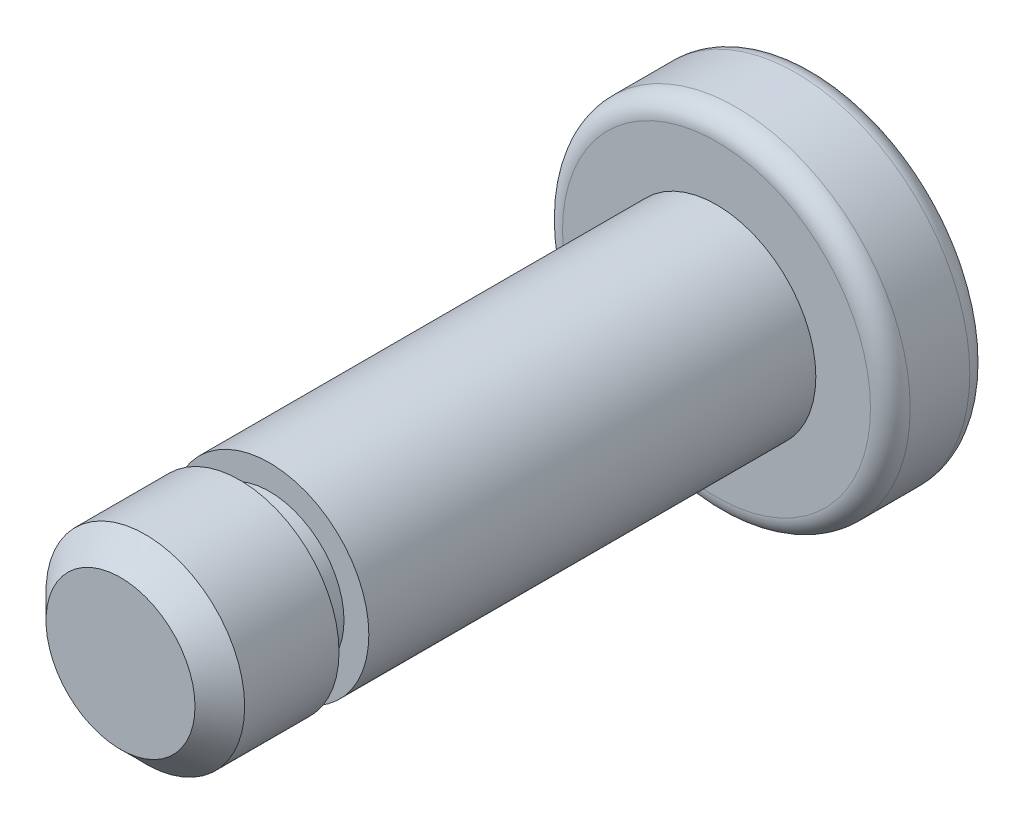
ISO-10303-21;
HEADER;
FILE_DESCRIPTION(('STEP AP214'),'2;1');
FILE_NAME('part.step','',(''),(''),'','','');
FILE_SCHEMA(('AUTOMOTIVE_DESIGN { 1 0 10303 214 1 1 1 1 }'));
ENDSEC;
DATA;
#1=APPLICATION_CONTEXT('core data for automotive mechanical design processes');
#2=APPLICATION_PROTOCOL_DEFINITION('international standard','automotive_design',2000,#1);
#3=PRODUCT_CONTEXT('',#1,'mechanical');
#4=PRODUCT('Part','Part','',(#3));
#5=PRODUCT_RELATED_PRODUCT_CATEGORY('part','',(#4));
#6=PRODUCT_DEFINITION_FORMATION('','',#4);
#7=PRODUCT_DEFINITION_CONTEXT('part definition',#1,'design');
#8=PRODUCT_DEFINITION('design','',#6,#7);
#9=PRODUCT_DEFINITION_SHAPE('','',#8);
#10=(LENGTH_UNIT() NAMED_UNIT(*) SI_UNIT(.MILLI.,.METRE.));
#11=(NAMED_UNIT(*) PLANE_ANGLE_UNIT() SI_UNIT($,.RADIAN.));
#12=(NAMED_UNIT(*) SI_UNIT($,.STERADIAN.) SOLID_ANGLE_UNIT());
#13=UNCERTAINTY_MEASURE_WITH_UNIT(LENGTH_MEASURE(1.E-05),#10,'distance_accuracy_value','');
#14=(GEOMETRIC_REPRESENTATION_CONTEXT(3) GLOBAL_UNCERTAINTY_ASSIGNED_CONTEXT((#13)) GLOBAL_UNIT_ASSIGNED_CONTEXT((#10,
#11,#12)) REPRESENTATION_CONTEXT('',''));
#15=CARTESIAN_POINT('',(0.,0.,0.));
#16=DIRECTION('',(0.,0.,1.));
#17=DIRECTION('',(1.,0.,0.));
#18=AXIS2_PLACEMENT_3D('',#15,#16,#17);
#19=CARTESIAN_POINT('',(0.,0.,14.));
#20=DIRECTION('',(0.,0.,-1.));
#21=DIRECTION('',(-1.,0.,0.));
#22=AXIS2_PLACEMENT_3D('',#19,#20,#21);
#23=CYLINDRICAL_SURFACE('',#22,2.);
#24=CARTESIAN_POINT('',(0.,0.,2.));
#25=DIRECTION('',(0.,0.,1.));
#26=DIRECTION('',(1.,0.,0.));
#27=AXIS2_PLACEMENT_3D('',#24,#25,#26);
#28=CIRCLE('',#27,2.);
#29=CARTESIAN_POINT('',(2.,0.,2.));
#30=VERTEX_POINT('',#29);
#31=EDGE_CURVE('E60',#30,#30,#28,.T.);
#32=ORIENTED_EDGE('',*,*,#31,.T.);
#33=EDGE_LOOP('',(#32));
#34=FACE_BOUND('',#33,.T.);
#35=CARTESIAN_POINT('',(0.,0.,11.));
#36=DIRECTION('',(0.,0.,1.));
#37=DIRECTION('',(1.,0.,0.));
#38=AXIS2_PLACEMENT_3D('',#35,#36,#37);
#39=CIRCLE('',#38,2.);
#40=CARTESIAN_POINT('',(2.,0.,11.));
#41=VERTEX_POINT('',#40);
#42=EDGE_CURVE('E64',#41,#41,#39,.T.);
#43=ORIENTED_EDGE('',*,*,#42,.F.);
#44=EDGE_LOOP('',(#43));
#45=FACE_BOUND('',#44,.T.);
#46=ADVANCED_FACE('F34',(#34,#45),#23,.T.);
#47=CARTESIAN_POINT('',(0.,0.,2.));
#48=DIRECTION('',(0.,0.,-1.));
#49=DIRECTION('',(-1.,0.,0.));
#50=AXIS2_PLACEMENT_3D('',#47,#48,#49);
#51=CYLINDRICAL_SURFACE('',#50,3.5);
#52=CARTESIAN_POINT('',(0.,0.,0.4));
#53=DIRECTION('',(0.,0.,1.));
#54=DIRECTION('',(1.,0.,0.));
#55=AXIS2_PLACEMENT_3D('',#52,#53,#54);
#56=CIRCLE('',#55,3.5);
#57=CARTESIAN_POINT('',(3.5,0.,0.4));
#58=VERTEX_POINT('',#57);
#59=EDGE_CURVE('E45',#58,#58,#56,.T.);
#60=ORIENTED_EDGE('',*,*,#59,.T.);
#61=EDGE_LOOP('',(#60));
#62=FACE_BOUND('',#61,.T.);
#63=CARTESIAN_POINT('',(0.,0.,1.6));
#64=DIRECTION('',(0.,0.,1.));
#65=DIRECTION('',(1.,0.,0.));
#66=AXIS2_PLACEMENT_3D('',#63,#64,#65);
#67=CIRCLE('',#66,3.5);
#68=CARTESIAN_POINT('',(3.5,0.,1.6));
#69=VERTEX_POINT('',#68);
#70=EDGE_CURVE('E49',#69,#69,#67,.F.);
#71=ORIENTED_EDGE('',*,*,#70,.T.);
#72=EDGE_LOOP('',(#71));
#73=FACE_BOUND('',#72,.T.);
#74=ADVANCED_FACE('F97',(#62,#73),#51,.T.);
#75=CARTESIAN_POINT('',(0.,0.,2.));
#76=DIRECTION('',(0.,0.,1.));
#77=DIRECTION('',(1.,0.,0.));
#78=AXIS2_PLACEMENT_3D('',#75,#76,#77);
#79=PLANE('',#78);
#80=CARTESIAN_POINT('',(0.,0.,2.));
#81=DIRECTION('',(0.,0.,1.));
#82=DIRECTION('',(1.,0.,0.));
#83=AXIS2_PLACEMENT_3D('',#80,#81,#82);
#84=CIRCLE('',#83,3.1);
#85=CARTESIAN_POINT('',(3.1,0.,2.));
#86=VERTEX_POINT('',#85);
#87=EDGE_CURVE('E10',#86,#86,#84,.T.);
#88=ORIENTED_EDGE('',*,*,#87,.T.);
#89=EDGE_LOOP('',(#88));
#90=FACE_BOUND('',#89,.T.);
#91=ORIENTED_EDGE('',*,*,#31,.F.);
#92=EDGE_LOOP('',(#91));
#93=FACE_BOUND('',#92,.T.);
#94=ADVANCED_FACE('F104',(#90,#93),#79,.T.);
#95=CARTESIAN_POINT('',(0.,0.,0.));
#96=DIRECTION('',(0.,0.,1.));
#97=DIRECTION('',(1.,0.,0.));
#98=AXIS2_PLACEMENT_3D('',#95,#96,#97);
#99=PLANE('',#98);
#100=CARTESIAN_POINT('',(0.,0.,0.));
#101=DIRECTION('',(0.,0.,1.));
#102=DIRECTION('',(1.,0.,0.));
#103=AXIS2_PLACEMENT_3D('',#100,#101,#102);
#104=CIRCLE('',#103,3.1);
#105=CARTESIAN_POINT('',(3.1,0.,0.));
#106=VERTEX_POINT('',#105);
#107=EDGE_CURVE('E41',#106,#106,#104,.F.);
#108=ORIENTED_EDGE('',*,*,#107,.T.);
#109=EDGE_LOOP('',(#108));
#110=FACE_BOUND('',#109,.T.);
#111=ADVANCED_FACE('F92',(#110),#99,.F.);
#112=CARTESIAN_POINT('',(0.,0.,11.6));
#113=DIRECTION('',(0.,0.,1.));
#114=DIRECTION('',(1.,0.,0.));
#115=AXIS2_PLACEMENT_3D('',#112,#113,#114);
#116=PLANE('',#115);
#117=CARTESIAN_POINT('',(0.,0.,11.6));
#118=DIRECTION('',(0.,0.,1.));
#119=DIRECTION('',(1.,0.,0.));
#120=AXIS2_PLACEMENT_3D('',#117,#118,#119);
#121=CIRCLE('',#120,2.);
#122=CARTESIAN_POINT('',(2.,0.,11.6));
#123=VERTEX_POINT('',#122);
#124=EDGE_CURVE('E63',#123,#123,#121,.T.);
#125=ORIENTED_EDGE('',*,*,#124,.F.);
#126=EDGE_LOOP('',(#125));
#127=FACE_BOUND('',#126,.T.);
#128=CARTESIAN_POINT('',(0.,0.,11.6));
#129=DIRECTION('',(0.,0.,1.));
#130=DIRECTION('',(1.,0.,0.));
#131=AXIS2_PLACEMENT_3D('',#128,#129,#130);
#132=CIRCLE('',#131,1.5);
#133=CARTESIAN_POINT('',(1.5,0.,11.6));
#134=VERTEX_POINT('',#133);
#135=EDGE_CURVE('E67',#134,#134,#132,.T.);
#136=ORIENTED_EDGE('',*,*,#135,.T.);
#137=EDGE_LOOP('',(#136));
#138=FACE_BOUND('',#137,.T.);
#139=ADVANCED_FACE('F76',(#127,#138),#116,.F.);
#140=CARTESIAN_POINT('',(0.,0.,11.));
#141=DIRECTION('',(0.,0.,1.));
#142=DIRECTION('',(1.,0.,0.));
#143=AXIS2_PLACEMENT_3D('',#140,#141,#142);
#144=PLANE('',#143);
#145=ORIENTED_EDGE('',*,*,#42,.T.);
#146=EDGE_LOOP('',(#145));
#147=FACE_BOUND('',#146,.T.);
#148=CARTESIAN_POINT('',(0.,0.,11.));
#149=DIRECTION('',(0.,0.,1.));
#150=DIRECTION('',(1.,0.,0.));
#151=AXIS2_PLACEMENT_3D('',#148,#149,#150);
#152=CIRCLE('',#151,1.5);
#153=CARTESIAN_POINT('',(1.5,0.,11.));
#154=VERTEX_POINT('',#153);
#155=EDGE_CURVE('E70',#154,#154,#152,.T.);
#156=ORIENTED_EDGE('',*,*,#155,.F.);
#157=EDGE_LOOP('',(#156));
#158=FACE_BOUND('',#157,.T.);
#159=ADVANCED_FACE('F82',(#147,#158),#144,.T.);
#160=CARTESIAN_POINT('',(0.,0.,11.6));
#161=DIRECTION('',(0.,0.,-1.));
#162=DIRECTION('',(-1.,0.,0.));
#163=AXIS2_PLACEMENT_3D('',#160,#161,#162);
#164=CYLINDRICAL_SURFACE('',#163,1.5);
#165=ORIENTED_EDGE('',*,*,#135,.F.);
#166=EDGE_LOOP('',(#165));
#167=FACE_BOUND('',#166,.T.);
#168=ORIENTED_EDGE('',*,*,#155,.T.);
#169=EDGE_LOOP('',(#168));
#170=FACE_BOUND('',#169,.T.);
#171=ADVANCED_FACE('F78',(#167,#170),#164,.T.);
#172=CARTESIAN_POINT('',(0.,0.,14.));
#173=DIRECTION('',(0.,0.,1.));
#174=DIRECTION('',(1.,0.,0.));
#175=AXIS2_PLACEMENT_3D('',#172,#173,#174);
#176=PLANE('',#175);
#177=CARTESIAN_POINT('',(0.,0.,14.));
#178=DIRECTION('',(0.,0.,1.));
#179=DIRECTION('',(1.,0.,0.));
#180=AXIS2_PLACEMENT_3D('',#177,#178,#179);
#181=CIRCLE('',#180,1.5);
#182=CARTESIAN_POINT('',(1.5,0.,14.));
#183=VERTEX_POINT('',#182);
#184=EDGE_CURVE('E57',#183,#183,#181,.T.);
#185=ORIENTED_EDGE('',*,*,#184,.T.);
#186=EDGE_LOOP('',(#185));
#187=FACE_BOUND('',#186,.T.);
#188=ADVANCED_FACE('F81',(#187),#176,.T.);
#189=CARTESIAN_POINT('',(0.,0.,13.5));
#190=DIRECTION('',(0.,0.,1.));
#191=DIRECTION('',(1.,0.,0.));
#192=AXIS2_PLACEMENT_3D('',#189,#190,#191);
#193=CIRCLE('',#192,2.);
#194=CARTESIAN_POINT('',(2.,0.,13.5));
#195=VERTEX_POINT('',#194);
#196=EDGE_CURVE('E54',#195,#195,#193,.F.);
#197=ORIENTED_EDGE('',*,*,#196,.T.);
#198=EDGE_LOOP('',(#197));
#199=FACE_BOUND('',#198,.T.);
#200=ORIENTED_EDGE('',*,*,#124,.T.);
#201=EDGE_LOOP('',(#200));
#202=FACE_BOUND('',#201,.T.);
#203=ADVANCED_FACE('F100',(#199,#202),#23,.T.);
#204=CARTESIAN_POINT('',(0.,0.,14.));
#205=DIRECTION('',(0.,0.,-1.));
#206=DIRECTION('',(-1.,0.,0.));
#207=AXIS2_PLACEMENT_3D('',#204,#205,#206);
#208=CONICAL_SURFACE('',#207,1.5,0.785398163397447);
#209=ORIENTED_EDGE('',*,*,#196,.F.);
#210=EDGE_LOOP('',(#209));
#211=FACE_BOUND('',#210,.T.);
#212=ORIENTED_EDGE('',*,*,#184,.F.);
#213=EDGE_LOOP('',(#212));
#214=FACE_BOUND('',#213,.T.);
#215=ADVANCED_FACE('F110',(#211,#214),#208,.T.);
#216=CARTESIAN_POINT('',(0.,0.,0.4));
#217=DIRECTION('',(0.,0.,1.));
#218=DIRECTION('',(1.,0.,0.));
#219=AXIS2_PLACEMENT_3D('',#216,#217,#218);
#220=TOROIDAL_SURFACE('',#219,3.1,0.4);
#221=ORIENTED_EDGE('',*,*,#107,.F.);
#222=EDGE_LOOP('',(#221));
#223=FACE_BOUND('',#222,.T.);
#224=ORIENTED_EDGE('',*,*,#59,.F.);
#225=EDGE_LOOP('',(#224));
#226=FACE_BOUND('',#225,.T.);
#227=ADVANCED_FACE('F116',(#223,#226),#220,.T.);
#228=CARTESIAN_POINT('',(0.,0.,1.6));
#229=DIRECTION('',(0.,0.,1.));
#230=DIRECTION('',(1.,0.,0.));
#231=AXIS2_PLACEMENT_3D('',#228,#229,#230);
#232=TOROIDAL_SURFACE('',#231,3.1,0.4);
#233=ORIENTED_EDGE('',*,*,#70,.F.);
#234=EDGE_LOOP('',(#233));
#235=FACE_BOUND('',#234,.T.);
#236=ORIENTED_EDGE('',*,*,#87,.F.);
#237=EDGE_LOOP('',(#236));
#238=FACE_BOUND('',#237,.T.);
#239=ADVANCED_FACE('F36',(#235,#238),#232,.T.);
#240=CLOSED_SHELL('',(#46,#74,#94,#111,#139,#159,#171,#188,#203,#215,#227,#239));
#241=MANIFOLD_SOLID_BREP('B2',#240);
#242=ADVANCED_BREP_SHAPE_REPRESENTATION('',(#18,#241),#14);
#243=SHAPE_DEFINITION_REPRESENTATION(#9,#242);
ENDSEC;
END-ISO-10303-21;
